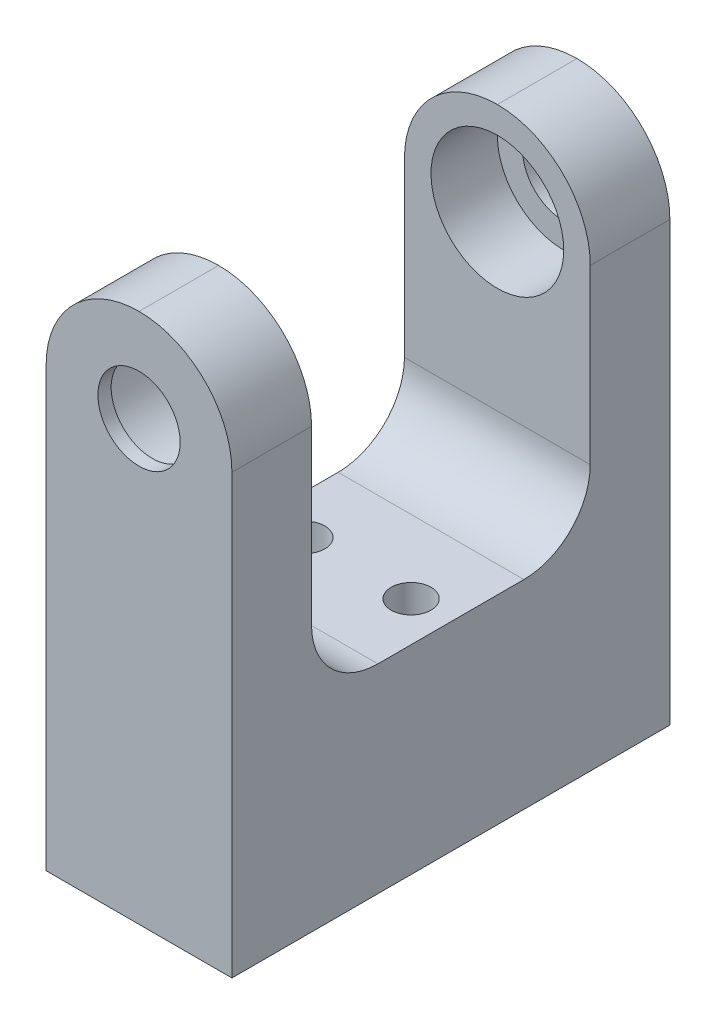
ISO-10303-21;
HEADER;
FILE_DESCRIPTION(('STEP AP214'),'2;1');
FILE_NAME('part.step','',(''),(''),'','','');
FILE_SCHEMA(('AUTOMOTIVE_DESIGN { 1 0 10303 214 1 1 1 1 }'));
ENDSEC;
DATA;
#1=APPLICATION_CONTEXT('core data for automotive mechanical design processes');
#2=APPLICATION_PROTOCOL_DEFINITION('international standard','automotive_design',2000,#1);
#3=PRODUCT_CONTEXT('',#1,'mechanical');
#4=PRODUCT('Part','Part','',(#3));
#5=PRODUCT_RELATED_PRODUCT_CATEGORY('part','',(#4));
#6=PRODUCT_DEFINITION_FORMATION('','',#4);
#7=PRODUCT_DEFINITION_CONTEXT('part definition',#1,'design');
#8=PRODUCT_DEFINITION('design','',#6,#7);
#9=PRODUCT_DEFINITION_SHAPE('','',#8);
#10=(LENGTH_UNIT() NAMED_UNIT(*) SI_UNIT(.MILLI.,.METRE.));
#11=(NAMED_UNIT(*) PLANE_ANGLE_UNIT() SI_UNIT($,.RADIAN.));
#12=(NAMED_UNIT(*) SI_UNIT($,.STERADIAN.) SOLID_ANGLE_UNIT());
#13=UNCERTAINTY_MEASURE_WITH_UNIT(LENGTH_MEASURE(1.E-05),#10,'distance_accuracy_value','');
#14=(GEOMETRIC_REPRESENTATION_CONTEXT(3) GLOBAL_UNCERTAINTY_ASSIGNED_CONTEXT((#13)) GLOBAL_UNIT_ASSIGNED_CONTEXT((#10,
#11,#12)) REPRESENTATION_CONTEXT('',''));
#15=CARTESIAN_POINT('',(0.,0.,0.));
#16=DIRECTION('',(0.,0.,1.));
#17=DIRECTION('',(1.,0.,0.));
#18=AXIS2_PLACEMENT_3D('',#15,#16,#17);
#19=CARTESIAN_POINT('',(14.,0.,0.));
#20=DIRECTION('',(0.,1.,0.));
#21=DIRECTION('',(0.,0.,1.));
#22=AXIS2_PLACEMENT_3D('',#19,#20,#21);
#23=PLANE('',#22);
#24=CARTESIAN_POINT('',(3.,0.,0.));
#25=DIRECTION('',(0.,1.,0.));
#26=DIRECTION('',(0.,0.,1.));
#27=AXIS2_PLACEMENT_3D('',#24,#25,#26);
#28=CIRCLE('',#27,1.5);
#29=CARTESIAN_POINT('',(3.,0.,1.5));
#30=VERTEX_POINT('',#29);
#31=EDGE_CURVE('E233',#30,#30,#28,.T.);
#32=ORIENTED_EDGE('',*,*,#31,.T.);
#33=EDGE_LOOP('',(#32));
#34=FACE_BOUND('',#33,.T.);
#35=CARTESIAN_POINT('',(11.,0.,0.));
#36=DIRECTION('',(0.,1.,0.));
#37=DIRECTION('',(0.,0.,1.));
#38=AXIS2_PLACEMENT_3D('',#35,#36,#37);
#39=CIRCLE('',#38,1.5);
#40=CARTESIAN_POINT('',(11.,0.,1.5));
#41=VERTEX_POINT('',#40);
#42=EDGE_CURVE('E225',#41,#41,#39,.T.);
#43=ORIENTED_EDGE('',*,*,#42,.T.);
#44=EDGE_LOOP('',(#43));
#45=FACE_BOUND('',#44,.T.);
#46=DIRECTION('',(0.,0.,-1.));
#47=VECTOR('',#46,1.);
#48=CARTESIAN_POINT('',(0.,0.,0.));
#49=LINE('',#48,#47);
#50=CARTESIAN_POINT('',(0.,0.,16.5));
#51=VERTEX_POINT('',#50);
#52=CARTESIAN_POINT('',(0.,0.,-16.5));
#53=VERTEX_POINT('',#52);
#54=EDGE_CURVE('E139',#51,#53,#49,.T.);
#55=ORIENTED_EDGE('',*,*,#54,.T.);
#56=DIRECTION('',(-1.,0.,0.));
#57=VECTOR('',#56,1.);
#58=CARTESIAN_POINT('',(14.,0.,-16.5));
#59=LINE('',#58,#57);
#60=CARTESIAN_POINT('',(14.,0.,-16.5));
#61=VERTEX_POINT('',#60);
#62=EDGE_CURVE('E137',#61,#53,#59,.T.);
#63=ORIENTED_EDGE('',*,*,#62,.F.);
#64=DIRECTION('',(0.,0.,-1.));
#65=VECTOR('',#64,1.);
#66=CARTESIAN_POINT('',(14.,0.,16.5));
#67=LINE('',#66,#65);
#68=CARTESIAN_POINT('',(14.,0.,16.5));
#69=VERTEX_POINT('',#68);
#70=EDGE_CURVE('E124',#69,#61,#67,.T.);
#71=ORIENTED_EDGE('',*,*,#70,.F.);
#72=DIRECTION('',(-1.,0.,0.));
#73=VECTOR('',#72,1.);
#74=CARTESIAN_POINT('',(14.,0.,16.5));
#75=LINE('',#74,#73);
#76=EDGE_CURVE('E160',#69,#51,#75,.T.);
#77=ORIENTED_EDGE('',*,*,#76,.T.);
#78=EDGE_LOOP('',(#55,#63,#71,#77));
#79=FACE_BOUND('',#78,.T.);
#80=ADVANCED_FACE('F36',(#34,#45,#79),#23,.F.);
#81=CARTESIAN_POINT('',(14.,0.,-16.5));
#82=DIRECTION('',(0.,0.,1.));
#83=DIRECTION('',(1.,0.,0.));
#84=AXIS2_PLACEMENT_3D('',#81,#82,#83);
#85=PLANE('',#84);
#86=CARTESIAN_POINT('',(7.,33.,-16.5));
#87=DIRECTION('',(0.,0.,1.));
#88=DIRECTION('',(1.,0.,0.));
#89=AXIS2_PLACEMENT_3D('',#86,#87,#88);
#90=CIRCLE('',#89,3.1);
#91=CARTESIAN_POINT('',(10.1,33.,-16.5));
#92=VERTEX_POINT('',#91);
#93=EDGE_CURVE('E241',#92,#92,#90,.T.);
#94=ORIENTED_EDGE('',*,*,#93,.T.);
#95=EDGE_LOOP('',(#94));
#96=FACE_BOUND('',#95,.T.);
#97=DIRECTION('',(0.,1.,0.));
#98=VECTOR('',#97,1.);
#99=CARTESIAN_POINT('',(0.,0.,-16.5));
#100=LINE('',#99,#98);
#101=CARTESIAN_POINT('',(0.,33.,-16.5));
#102=VERTEX_POINT('',#101);
#103=EDGE_CURVE('E162',#53,#102,#100,.T.);
#104=ORIENTED_EDGE('',*,*,#103,.T.);
#105=CARTESIAN_POINT('',(7.,33.,-16.5));
#106=DIRECTION('',(0.,0.,1.));
#107=DIRECTION('',(1.,0.,0.));
#108=AXIS2_PLACEMENT_3D('',#105,#106,#107);
#109=CIRCLE('',#108,7.);
#110=CARTESIAN_POINT('',(7.,40.,-16.5));
#111=VERTEX_POINT('',#110);
#112=EDGE_CURVE('E58',#102,#111,#109,.F.);
#113=ORIENTED_EDGE('',*,*,#112,.T.);
#114=CARTESIAN_POINT('',(7.,33.,-16.5));
#115=DIRECTION('',(0.,0.,1.));
#116=DIRECTION('',(1.,0.,0.));
#117=AXIS2_PLACEMENT_3D('',#114,#115,#116);
#118=CIRCLE('',#117,7.);
#119=CARTESIAN_POINT('',(14.,33.,-16.5));
#120=VERTEX_POINT('',#119);
#121=EDGE_CURVE('E53',#111,#120,#118,.F.);
#122=ORIENTED_EDGE('',*,*,#121,.T.);
#123=DIRECTION('',(0.,1.,0.));
#124=VECTOR('',#123,1.);
#125=CARTESIAN_POINT('',(14.,0.,-16.5));
#126=LINE('',#125,#124);
#127=EDGE_CURVE('E127',#61,#120,#126,.T.);
#128=ORIENTED_EDGE('',*,*,#127,.F.);
#129=ORIENTED_EDGE('',*,*,#62,.T.);
#130=EDGE_LOOP('',(#104,#113,#122,#128,#129));
#131=FACE_BOUND('',#130,.T.);
#132=ADVANCED_FACE('F144',(#96,#131),#85,.F.);
#133=CARTESIAN_POINT('',(14.,40.,-10.5));
#134=DIRECTION('',(0.,0.,-1.));
#135=DIRECTION('',(0.,1.,0.));
#136=AXIS2_PLACEMENT_3D('',#133,#134,#135);
#137=PLANE('',#136);
#138=CARTESIAN_POINT('',(7.,33.,-10.5));
#139=DIRECTION('',(0.,0.,-1.));
#140=DIRECTION('',(0.,1.,0.));
#141=AXIS2_PLACEMENT_3D('',#138,#139,#140);
#142=CIRCLE('',#141,5.);
#143=CARTESIAN_POINT('',(7.,38.,-10.5));
#144=VERTEX_POINT('',#143);
#145=EDGE_CURVE('E214',#144,#144,#142,.T.);
#146=ORIENTED_EDGE('',*,*,#145,.T.);
#147=EDGE_LOOP('',(#146));
#148=FACE_BOUND('',#147,.T.);
#149=CARTESIAN_POINT('',(7.,33.,-10.5));
#150=DIRECTION('',(0.,0.,-1.));
#151=DIRECTION('',(0.,1.,0.));
#152=AXIS2_PLACEMENT_3D('',#149,#150,#151);
#153=CIRCLE('',#152,7.);
#154=CARTESIAN_POINT('',(14.,33.,-10.5));
#155=VERTEX_POINT('',#154);
#156=CARTESIAN_POINT('',(7.,40.,-10.5));
#157=VERTEX_POINT('',#156);
#158=EDGE_CURVE('E202',#155,#157,#153,.F.);
#159=ORIENTED_EDGE('',*,*,#158,.T.);
#160=CARTESIAN_POINT('',(7.,33.,-10.5));
#161=DIRECTION('',(0.,0.,-1.));
#162=DIRECTION('',(0.,1.,0.));
#163=AXIS2_PLACEMENT_3D('',#160,#161,#162);
#164=CIRCLE('',#163,7.);
#165=CARTESIAN_POINT('',(0.,33.,-10.5));
#166=VERTEX_POINT('',#165);
#167=EDGE_CURVE('E204',#157,#166,#164,.F.);
#168=ORIENTED_EDGE('',*,*,#167,.T.);
#169=DIRECTION('',(0.,-1.,0.));
#170=VECTOR('',#169,1.);
#171=CARTESIAN_POINT('',(0.,40.,-10.5));
#172=LINE('',#171,#170);
#173=CARTESIAN_POINT('',(0.,20.,-10.5));
#174=VERTEX_POINT('',#173);
#175=EDGE_CURVE('E165',#166,#174,#172,.T.);
#176=ORIENTED_EDGE('',*,*,#175,.T.);
#177=DIRECTION('',(-1.,0.,0.));
#178=VECTOR('',#177,1.);
#179=CARTESIAN_POINT('',(14.,20.,-10.5));
#180=LINE('',#179,#178);
#181=CARTESIAN_POINT('',(14.,20.,-10.5));
#182=VERTEX_POINT('',#181);
#183=EDGE_CURVE('E142',#182,#174,#180,.T.);
#184=ORIENTED_EDGE('',*,*,#183,.F.);
#185=DIRECTION('',(0.,-1.,0.));
#186=VECTOR('',#185,1.);
#187=CARTESIAN_POINT('',(14.,40.,-10.5));
#188=LINE('',#187,#186);
#189=EDGE_CURVE('E145',#155,#182,#188,.T.);
#190=ORIENTED_EDGE('',*,*,#189,.F.);
#191=EDGE_LOOP('',(#159,#168,#176,#184,#190));
#192=FACE_BOUND('',#191,.T.);
#193=ADVANCED_FACE('F251',(#148,#192),#137,.F.);
#194=CARTESIAN_POINT('',(14.,20.,-5.5));
#195=DIRECTION('',(-1.,0.,0.));
#196=DIRECTION('',(0.,0.,1.));
#197=AXIS2_PLACEMENT_3D('',#194,#195,#196);
#198=CYLINDRICAL_SURFACE('',#197,5.);
#199=CARTESIAN_POINT('',(0.,20.,-5.5));
#200=DIRECTION('',(-1.,0.,0.));
#201=DIRECTION('',(0.,0.,1.));
#202=AXIS2_PLACEMENT_3D('',#199,#200,#201);
#203=CIRCLE('',#202,5.);
#204=CARTESIAN_POINT('',(0.,15.,-5.5));
#205=VERTEX_POINT('',#204);
#206=EDGE_CURVE('E167',#174,#205,#203,.T.);
#207=ORIENTED_EDGE('',*,*,#206,.T.);
#208=DIRECTION('',(-1.,0.,0.));
#209=VECTOR('',#208,1.);
#210=CARTESIAN_POINT('',(14.,15.,-5.5));
#211=LINE('',#210,#209);
#212=CARTESIAN_POINT('',(14.,15.,-5.5));
#213=VERTEX_POINT('',#212);
#214=EDGE_CURVE('E184',#213,#205,#211,.T.);
#215=ORIENTED_EDGE('',*,*,#214,.F.);
#216=CARTESIAN_POINT('',(14.,20.,-5.5));
#217=DIRECTION('',(-1.,0.,0.));
#218=DIRECTION('',(0.,0.,1.));
#219=AXIS2_PLACEMENT_3D('',#216,#217,#218);
#220=CIRCLE('',#219,5.);
#221=EDGE_CURVE('E147',#182,#213,#220,.T.);
#222=ORIENTED_EDGE('',*,*,#221,.F.);
#223=ORIENTED_EDGE('',*,*,#183,.T.);
#224=EDGE_LOOP('',(#207,#215,#222,#223));
#225=FACE_BOUND('',#224,.T.);
#226=ADVANCED_FACE('F311',(#225),#198,.F.);
#227=CARTESIAN_POINT('',(14.,15.,-5.5));
#228=DIRECTION('',(0.,-1.,0.));
#229=DIRECTION('',(0.,0.,-1.));
#230=AXIS2_PLACEMENT_3D('',#227,#228,#229);
#231=PLANE('',#230);
#232=CARTESIAN_POINT('',(3.,15.,0.));
#233=DIRECTION('',(0.,-1.,0.));
#234=DIRECTION('',(0.,0.,-1.));
#235=AXIS2_PLACEMENT_3D('',#232,#233,#234);
#236=CIRCLE('',#235,1.5);
#237=CARTESIAN_POINT('',(3.,15.,-1.49999999999999));
#238=VERTEX_POINT('',#237);
#239=EDGE_CURVE('E40',#238,#238,#236,.T.);
#240=ORIENTED_EDGE('',*,*,#239,.T.);
#241=EDGE_LOOP('',(#240));
#242=FACE_BOUND('',#241,.T.);
#243=CARTESIAN_POINT('',(11.,15.,0.));
#244=DIRECTION('',(0.,-1.,0.));
#245=DIRECTION('',(0.,0.,-1.));
#246=AXIS2_PLACEMENT_3D('',#243,#244,#245);
#247=CIRCLE('',#246,1.5);
#248=CARTESIAN_POINT('',(11.,15.,-1.5));
#249=VERTEX_POINT('',#248);
#250=EDGE_CURVE('E223',#249,#249,#247,.T.);
#251=ORIENTED_EDGE('',*,*,#250,.T.);
#252=EDGE_LOOP('',(#251));
#253=FACE_BOUND('',#252,.T.);
#254=DIRECTION('',(0.,0.,1.));
#255=VECTOR('',#254,1.);
#256=CARTESIAN_POINT('',(0.,15.,-5.5));
#257=LINE('',#256,#255);
#258=CARTESIAN_POINT('',(0.,15.,5.50000000000001));
#259=VERTEX_POINT('',#258);
#260=EDGE_CURVE('E169',#205,#259,#257,.T.);
#261=ORIENTED_EDGE('',*,*,#260,.T.);
#262=DIRECTION('',(-1.,0.,0.));
#263=VECTOR('',#262,1.);
#264=CARTESIAN_POINT('',(14.,15.,5.50000000000001));
#265=LINE('',#264,#263);
#266=CARTESIAN_POINT('',(14.,15.,5.50000000000001));
#267=VERTEX_POINT('',#266);
#268=EDGE_CURVE('E181',#267,#259,#265,.T.);
#269=ORIENTED_EDGE('',*,*,#268,.F.);
#270=DIRECTION('',(0.,0.,1.));
#271=VECTOR('',#270,1.);
#272=CARTESIAN_POINT('',(14.,15.,-5.5));
#273=LINE('',#272,#271);
#274=EDGE_CURVE('E152',#213,#267,#273,.T.);
#275=ORIENTED_EDGE('',*,*,#274,.F.);
#276=ORIENTED_EDGE('',*,*,#214,.T.);
#277=EDGE_LOOP('',(#261,#269,#275,#276));
#278=FACE_BOUND('',#277,.T.);
#279=ADVANCED_FACE('F319',(#242,#253,#278),#231,.F.);
#280=CARTESIAN_POINT('',(14.,20.,5.50000000000001));
#281=DIRECTION('',(-1.,0.,0.));
#282=DIRECTION('',(0.,0.,1.));
#283=AXIS2_PLACEMENT_3D('',#280,#281,#282);
#284=CYLINDRICAL_SURFACE('',#283,5.);
#285=CARTESIAN_POINT('',(0.,20.,5.50000000000001));
#286=DIRECTION('',(-1.,0.,0.));
#287=DIRECTION('',(0.,0.,1.));
#288=AXIS2_PLACEMENT_3D('',#285,#286,#287);
#289=CIRCLE('',#288,5.);
#290=CARTESIAN_POINT('',(0.,20.,10.5));
#291=VERTEX_POINT('',#290);
#292=EDGE_CURVE('E171',#259,#291,#289,.T.);
#293=ORIENTED_EDGE('',*,*,#292,.T.);
#294=DIRECTION('',(-1.,0.,0.));
#295=VECTOR('',#294,1.);
#296=CARTESIAN_POINT('',(14.,20.,10.5));
#297=LINE('',#296,#295);
#298=CARTESIAN_POINT('',(14.,20.,10.5));
#299=VERTEX_POINT('',#298);
#300=EDGE_CURVE('E178',#299,#291,#297,.T.);
#301=ORIENTED_EDGE('',*,*,#300,.F.);
#302=CARTESIAN_POINT('',(14.,20.,5.50000000000001));
#303=DIRECTION('',(-1.,0.,0.));
#304=DIRECTION('',(0.,0.,1.));
#305=AXIS2_PLACEMENT_3D('',#302,#303,#304);
#306=CIRCLE('',#305,5.);
#307=EDGE_CURVE('E154',#267,#299,#306,.T.);
#308=ORIENTED_EDGE('',*,*,#307,.F.);
#309=ORIENTED_EDGE('',*,*,#268,.T.);
#310=EDGE_LOOP('',(#293,#301,#308,#309));
#311=FACE_BOUND('',#310,.T.);
#312=ADVANCED_FACE('F322',(#311),#284,.F.);
#313=CARTESIAN_POINT('',(14.,20.,10.5));
#314=DIRECTION('',(0.,0.,1.));
#315=DIRECTION('',(1.,0.,0.));
#316=AXIS2_PLACEMENT_3D('',#313,#314,#315);
#317=PLANE('',#316);
#318=CARTESIAN_POINT('',(7.,33.,10.5));
#319=DIRECTION('',(0.,0.,1.));
#320=DIRECTION('',(1.,0.,0.));
#321=AXIS2_PLACEMENT_3D('',#318,#319,#320);
#322=CIRCLE('',#321,5.);
#323=CARTESIAN_POINT('',(12.,33.,10.5));
#324=VERTEX_POINT('',#323);
#325=EDGE_CURVE('E215',#324,#324,#322,.T.);
#326=ORIENTED_EDGE('',*,*,#325,.T.);
#327=EDGE_LOOP('',(#326));
#328=FACE_BOUND('',#327,.T.);
#329=DIRECTION('',(0.,1.,0.));
#330=VECTOR('',#329,1.);
#331=CARTESIAN_POINT('',(0.,20.,10.5));
#332=LINE('',#331,#330);
#333=CARTESIAN_POINT('',(0.,33.,10.5));
#334=VERTEX_POINT('',#333);
#335=EDGE_CURVE('E173',#291,#334,#332,.T.);
#336=ORIENTED_EDGE('',*,*,#335,.T.);
#337=CARTESIAN_POINT('',(7.,33.,10.5));
#338=DIRECTION('',(0.,0.,1.));
#339=DIRECTION('',(1.,0.,0.));
#340=AXIS2_PLACEMENT_3D('',#337,#338,#339);
#341=CIRCLE('',#340,7.);
#342=CARTESIAN_POINT('',(7.,40.,10.5));
#343=VERTEX_POINT('',#342);
#344=EDGE_CURVE('E200',#334,#343,#341,.F.);
#345=ORIENTED_EDGE('',*,*,#344,.T.);
#346=CARTESIAN_POINT('',(7.,33.,10.5));
#347=DIRECTION('',(0.,0.,1.));
#348=DIRECTION('',(1.,0.,0.));
#349=AXIS2_PLACEMENT_3D('',#346,#347,#348);
#350=CIRCLE('',#349,7.);
#351=CARTESIAN_POINT('',(14.,33.,10.5));
#352=VERTEX_POINT('',#351);
#353=EDGE_CURVE('E198',#343,#352,#350,.F.);
#354=ORIENTED_EDGE('',*,*,#353,.T.);
#355=DIRECTION('',(0.,1.,0.));
#356=VECTOR('',#355,1.);
#357=CARTESIAN_POINT('',(14.,20.,10.5));
#358=LINE('',#357,#356);
#359=EDGE_CURVE('E156',#299,#352,#358,.T.);
#360=ORIENTED_EDGE('',*,*,#359,.F.);
#361=ORIENTED_EDGE('',*,*,#300,.T.);
#362=EDGE_LOOP('',(#336,#345,#354,#360,#361));
#363=FACE_BOUND('',#362,.T.);
#364=ADVANCED_FACE('F326',(#328,#363),#317,.F.);
#365=CARTESIAN_POINT('',(14.,40.,16.5));
#366=DIRECTION('',(0.,0.,-1.));
#367=DIRECTION('',(0.,1.,0.));
#368=AXIS2_PLACEMENT_3D('',#365,#366,#367);
#369=PLANE('',#368);
#370=CARTESIAN_POINT('',(7.,33.,16.5));
#371=DIRECTION('',(0.,0.,1.));
#372=DIRECTION('',(1.,0.,0.));
#373=AXIS2_PLACEMENT_3D('',#370,#371,#372);
#374=CIRCLE('',#373,3.1);
#375=CARTESIAN_POINT('',(10.1,33.,16.5));
#376=VERTEX_POINT('',#375);
#377=EDGE_CURVE('E222',#376,#376,#374,.T.);
#378=ORIENTED_EDGE('',*,*,#377,.F.);
#379=EDGE_LOOP('',(#378));
#380=FACE_BOUND('',#379,.T.);
#381=CARTESIAN_POINT('',(7.,33.,16.5));
#382=DIRECTION('',(0.,0.,-1.));
#383=DIRECTION('',(0.,1.,0.));
#384=AXIS2_PLACEMENT_3D('',#381,#382,#383);
#385=CIRCLE('',#384,7.);
#386=CARTESIAN_POINT('',(14.,33.,16.5));
#387=VERTEX_POINT('',#386);
#388=CARTESIAN_POINT('',(7.,40.,16.5));
#389=VERTEX_POINT('',#388);
#390=EDGE_CURVE('E141',#387,#389,#385,.F.);
#391=ORIENTED_EDGE('',*,*,#390,.T.);
#392=CARTESIAN_POINT('',(7.,33.,16.5));
#393=DIRECTION('',(0.,0.,-1.));
#394=DIRECTION('',(0.,1.,0.));
#395=AXIS2_PLACEMENT_3D('',#392,#393,#394);
#396=CIRCLE('',#395,7.);
#397=CARTESIAN_POINT('',(0.,33.,16.5));
#398=VERTEX_POINT('',#397);
#399=EDGE_CURVE('E190',#389,#398,#396,.F.);
#400=ORIENTED_EDGE('',*,*,#399,.T.);
#401=DIRECTION('',(0.,-1.,0.));
#402=VECTOR('',#401,1.);
#403=CARTESIAN_POINT('',(0.,40.,16.5));
#404=LINE('',#403,#402);
#405=EDGE_CURVE('E134',#398,#51,#404,.T.);
#406=ORIENTED_EDGE('',*,*,#405,.T.);
#407=ORIENTED_EDGE('',*,*,#76,.F.);
#408=DIRECTION('',(0.,-1.,0.));
#409=VECTOR('',#408,1.);
#410=CARTESIAN_POINT('',(14.,40.,16.5));
#411=LINE('',#410,#409);
#412=EDGE_CURVE('E130',#387,#69,#411,.T.);
#413=ORIENTED_EDGE('',*,*,#412,.F.);
#414=EDGE_LOOP('',(#391,#400,#406,#407,#413));
#415=FACE_BOUND('',#414,.T.);
#416=ADVANCED_FACE('F333',(#380,#415),#369,.F.);
#417=CARTESIAN_POINT('',(14.,20.,-5.5));
#418=DIRECTION('',(-1.,0.,0.));
#419=DIRECTION('',(0.,0.,1.));
#420=AXIS2_PLACEMENT_3D('',#417,#418,#419);
#421=PLANE('',#420);
#422=ORIENTED_EDGE('',*,*,#127,.T.);
#423=DIRECTION('',(0.,0.,1.));
#424=VECTOR('',#423,1.);
#425=CARTESIAN_POINT('',(14.,33.,-5.5));
#426=LINE('',#425,#424);
#427=EDGE_CURVE('E11',#120,#155,#426,.T.);
#428=ORIENTED_EDGE('',*,*,#427,.T.);
#429=ORIENTED_EDGE('',*,*,#189,.T.);
#430=ORIENTED_EDGE('',*,*,#221,.T.);
#431=ORIENTED_EDGE('',*,*,#274,.T.);
#432=ORIENTED_EDGE('',*,*,#307,.T.);
#433=ORIENTED_EDGE('',*,*,#359,.T.);
#434=DIRECTION('',(0.,0.,1.));
#435=VECTOR('',#434,1.);
#436=CARTESIAN_POINT('',(14.,33.,-5.49999999999999));
#437=LINE('',#436,#435);
#438=EDGE_CURVE('E45',#352,#387,#437,.T.);
#439=ORIENTED_EDGE('',*,*,#438,.T.);
#440=ORIENTED_EDGE('',*,*,#412,.T.);
#441=ORIENTED_EDGE('',*,*,#70,.T.);
#442=EDGE_LOOP('',(#422,#428,#429,#430,#431,#432,#433,#439,#440,#441));
#443=FACE_BOUND('',#442,.T.);
#444=ADVANCED_FACE('F126',(#443),#421,.F.);
#445=CARTESIAN_POINT('',(0.,20.,-5.5));
#446=DIRECTION('',(-1.,0.,0.));
#447=DIRECTION('',(0.,0.,1.));
#448=AXIS2_PLACEMENT_3D('',#445,#446,#447);
#449=PLANE('',#448);
#450=ORIENTED_EDGE('',*,*,#405,.F.);
#451=DIRECTION('',(0.,0.,1.));
#452=VECTOR('',#451,1.);
#453=CARTESIAN_POINT('',(0.,33.,10.5));
#454=LINE('',#453,#452);
#455=EDGE_CURVE('E195',#398,#334,#454,.F.);
#456=ORIENTED_EDGE('',*,*,#455,.T.);
#457=ORIENTED_EDGE('',*,*,#335,.F.);
#458=ORIENTED_EDGE('',*,*,#292,.F.);
#459=ORIENTED_EDGE('',*,*,#260,.F.);
#460=ORIENTED_EDGE('',*,*,#206,.F.);
#461=ORIENTED_EDGE('',*,*,#175,.F.);
#462=DIRECTION('',(0.,0.,1.));
#463=VECTOR('',#462,1.);
#464=CARTESIAN_POINT('',(0.,33.,-16.5));
#465=LINE('',#464,#463);
#466=EDGE_CURVE('E192',#166,#102,#465,.F.);
#467=ORIENTED_EDGE('',*,*,#466,.T.);
#468=ORIENTED_EDGE('',*,*,#103,.F.);
#469=ORIENTED_EDGE('',*,*,#54,.F.);
#470=EDGE_LOOP('',(#450,#456,#457,#458,#459,#460,#461,#467,#468,#469));
#471=FACE_BOUND('',#470,.T.);
#472=ADVANCED_FACE('F288',(#471),#449,.T.);
#473=CARTESIAN_POINT('',(7.,33.,-5.49999999999999));
#474=DIRECTION('',(0.,0.,1.));
#475=DIRECTION('',(0.,-1.,0.));
#476=AXIS2_PLACEMENT_3D('',#473,#474,#475);
#477=CYLINDRICAL_SURFACE('',#476,7.);
#478=ORIENTED_EDGE('',*,*,#438,.F.);
#479=ORIENTED_EDGE('',*,*,#353,.F.);
#480=DIRECTION('',(0.,0.,1.));
#481=VECTOR('',#480,1.);
#482=CARTESIAN_POINT('',(7.,40.,10.5));
#483=LINE('',#482,#481);
#484=EDGE_CURVE('E163',#389,#343,#483,.F.);
#485=ORIENTED_EDGE('',*,*,#484,.F.);
#486=ORIENTED_EDGE('',*,*,#390,.F.);
#487=EDGE_LOOP('',(#478,#479,#485,#486));
#488=FACE_BOUND('',#487,.T.);
#489=ADVANCED_FACE('F285',(#488),#477,.T.);
#490=CARTESIAN_POINT('',(7.,33.,10.5));
#491=DIRECTION('',(0.,0.,-1.));
#492=DIRECTION('',(0.,1.,0.));
#493=AXIS2_PLACEMENT_3D('',#490,#491,#492);
#494=CYLINDRICAL_SURFACE('',#493,7.);
#495=ORIENTED_EDGE('',*,*,#344,.F.);
#496=ORIENTED_EDGE('',*,*,#455,.F.);
#497=ORIENTED_EDGE('',*,*,#399,.F.);
#498=ORIENTED_EDGE('',*,*,#484,.T.);
#499=EDGE_LOOP('',(#495,#496,#497,#498));
#500=FACE_BOUND('',#499,.T.);
#501=ADVANCED_FACE('F282',(#500),#494,.T.);
#502=CARTESIAN_POINT('',(7.,33.,-5.5));
#503=DIRECTION('',(0.,0.,1.));
#504=DIRECTION('',(1.,0.,0.));
#505=AXIS2_PLACEMENT_3D('',#502,#503,#504);
#506=CYLINDRICAL_SURFACE('',#505,7.);
#507=ORIENTED_EDGE('',*,*,#427,.F.);
#508=ORIENTED_EDGE('',*,*,#121,.F.);
#509=DIRECTION('',(0.,0.,1.));
#510=VECTOR('',#509,1.);
#511=CARTESIAN_POINT('',(7.,40.,-16.5));
#512=LINE('',#511,#510);
#513=EDGE_CURVE('E211',#157,#111,#512,.F.);
#514=ORIENTED_EDGE('',*,*,#513,.F.);
#515=ORIENTED_EDGE('',*,*,#158,.F.);
#516=EDGE_LOOP('',(#507,#508,#514,#515));
#517=FACE_BOUND('',#516,.T.);
#518=ADVANCED_FACE('F38',(#517),#506,.T.);
#519=CARTESIAN_POINT('',(7.,33.,-16.5));
#520=DIRECTION('',(0.,0.,-1.));
#521=DIRECTION('',(-1.,0.,0.));
#522=AXIS2_PLACEMENT_3D('',#519,#520,#521);
#523=CYLINDRICAL_SURFACE('',#522,7.);
#524=ORIENTED_EDGE('',*,*,#112,.F.);
#525=ORIENTED_EDGE('',*,*,#466,.F.);
#526=ORIENTED_EDGE('',*,*,#167,.F.);
#527=ORIENTED_EDGE('',*,*,#513,.T.);
#528=EDGE_LOOP('',(#524,#525,#526,#527));
#529=FACE_BOUND('',#528,.T.);
#530=ADVANCED_FACE('F290',(#529),#523,.T.);
#531=CARTESIAN_POINT('',(7.,33.,15.5));
#532=DIRECTION('',(0.,0.,1.));
#533=DIRECTION('',(1.,0.,0.));
#534=AXIS2_PLACEMENT_3D('',#531,#532,#533);
#535=PLANE('',#534);
#536=CARTESIAN_POINT('',(7.,33.,15.5));
#537=DIRECTION('',(0.,0.,1.));
#538=DIRECTION('',(1.,0.,0.));
#539=AXIS2_PLACEMENT_3D('',#536,#537,#538);
#540=CIRCLE('',#539,3.1);
#541=CARTESIAN_POINT('',(10.1,33.,15.5));
#542=VERTEX_POINT('',#541);
#543=EDGE_CURVE('E221',#542,#542,#540,.T.);
#544=ORIENTED_EDGE('',*,*,#543,.T.);
#545=EDGE_LOOP('',(#544));
#546=FACE_BOUND('',#545,.T.);
#547=CARTESIAN_POINT('',(7.,33.,15.5));
#548=DIRECTION('',(0.,0.,1.));
#549=DIRECTION('',(1.,0.,0.));
#550=AXIS2_PLACEMENT_3D('',#547,#548,#549);
#551=CIRCLE('',#550,5.);
#552=CARTESIAN_POINT('',(12.,33.,15.5));
#553=VERTEX_POINT('',#552);
#554=EDGE_CURVE('E244',#553,#553,#551,.T.);
#555=ORIENTED_EDGE('',*,*,#554,.F.);
#556=EDGE_LOOP('',(#555));
#557=FACE_BOUND('',#556,.T.);
#558=ADVANCED_FACE('F267',(#546,#557),#535,.F.);
#559=CARTESIAN_POINT('',(7.,33.,-15.5));
#560=DIRECTION('',(0.,0.,1.));
#561=DIRECTION('',(1.,0.,0.));
#562=AXIS2_PLACEMENT_3D('',#559,#560,#561);
#563=CYLINDRICAL_SURFACE('',#562,5.);
#564=ORIENTED_EDGE('',*,*,#554,.T.);
#565=EDGE_LOOP('',(#564));
#566=FACE_BOUND('',#565,.T.);
#567=ORIENTED_EDGE('',*,*,#325,.F.);
#568=EDGE_LOOP('',(#567));
#569=FACE_BOUND('',#568,.T.);
#570=ADVANCED_FACE('F257',(#566,#569),#563,.F.);
#571=CARTESIAN_POINT('',(7.,33.,-15.5));
#572=DIRECTION('',(0.,0.,1.));
#573=DIRECTION('',(1.,0.,0.));
#574=AXIS2_PLACEMENT_3D('',#571,#572,#573);
#575=CIRCLE('',#574,5.);
#576=CARTESIAN_POINT('',(12.,33.,-15.5));
#577=VERTEX_POINT('',#576);
#578=EDGE_CURVE('E218',#577,#577,#575,.T.);
#579=ORIENTED_EDGE('',*,*,#578,.F.);
#580=EDGE_LOOP('',(#579));
#581=FACE_BOUND('',#580,.T.);
#582=ORIENTED_EDGE('',*,*,#145,.F.);
#583=EDGE_LOOP('',(#582));
#584=FACE_BOUND('',#583,.T.);
#585=ADVANCED_FACE('F254',(#581,#584),#563,.F.);
#586=CARTESIAN_POINT('',(7.,33.,-15.5));
#587=DIRECTION('',(0.,0.,1.));
#588=DIRECTION('',(1.,0.,0.));
#589=AXIS2_PLACEMENT_3D('',#586,#587,#588);
#590=PLANE('',#589);
#591=CARTESIAN_POINT('',(7.,33.,-15.5));
#592=DIRECTION('',(0.,0.,1.));
#593=DIRECTION('',(1.,0.,0.));
#594=AXIS2_PLACEMENT_3D('',#591,#592,#593);
#595=CIRCLE('',#594,3.1);
#596=CARTESIAN_POINT('',(10.1,33.,-15.5));
#597=VERTEX_POINT('',#596);
#598=EDGE_CURVE('E219',#597,#597,#595,.T.);
#599=ORIENTED_EDGE('',*,*,#598,.F.);
#600=EDGE_LOOP('',(#599));
#601=FACE_BOUND('',#600,.T.);
#602=ORIENTED_EDGE('',*,*,#578,.T.);
#603=EDGE_LOOP('',(#602));
#604=FACE_BOUND('',#603,.T.);
#605=ADVANCED_FACE('F256',(#601,#604),#590,.T.);
#606=CARTESIAN_POINT('',(7.,33.,-18.5));
#607=DIRECTION('',(0.,0.,1.));
#608=DIRECTION('',(1.,0.,0.));
#609=AXIS2_PLACEMENT_3D('',#606,#607,#608);
#610=CYLINDRICAL_SURFACE('',#609,3.1);
#611=ORIENTED_EDGE('',*,*,#598,.T.);
#612=EDGE_LOOP('',(#611));
#613=FACE_BOUND('',#612,.T.);
#614=ORIENTED_EDGE('',*,*,#93,.F.);
#615=EDGE_LOOP('',(#614));
#616=FACE_BOUND('',#615,.T.);
#617=ADVANCED_FACE('F264',(#613,#616),#610,.F.);
#618=ORIENTED_EDGE('',*,*,#377,.T.);
#619=EDGE_LOOP('',(#618));
#620=FACE_BOUND('',#619,.T.);
#621=ORIENTED_EDGE('',*,*,#543,.F.);
#622=EDGE_LOOP('',(#621));
#623=FACE_BOUND('',#622,.T.);
#624=ADVANCED_FACE('F451',(#620,#623),#610,.F.);
#625=CARTESIAN_POINT('',(11.,-3.,0.));
#626=DIRECTION('',(0.,1.,0.));
#627=DIRECTION('',(0.,0.,1.));
#628=AXIS2_PLACEMENT_3D('',#625,#626,#627);
#629=CYLINDRICAL_SURFACE('',#628,1.5);
#630=ORIENTED_EDGE('',*,*,#250,.F.);
#631=EDGE_LOOP('',(#630));
#632=FACE_BOUND('',#631,.T.);
#633=ORIENTED_EDGE('',*,*,#42,.F.);
#634=EDGE_LOOP('',(#633));
#635=FACE_BOUND('',#634,.T.);
#636=ADVANCED_FACE('F445',(#632,#635),#629,.F.);
#637=CARTESIAN_POINT('',(3.,-3.,0.));
#638=DIRECTION('',(0.,1.,0.));
#639=DIRECTION('',(0.,0.,1.));
#640=AXIS2_PLACEMENT_3D('',#637,#638,#639);
#641=CYLINDRICAL_SURFACE('',#640,1.5);
#642=ORIENTED_EDGE('',*,*,#239,.F.);
#643=EDGE_LOOP('',(#642));
#644=FACE_BOUND('',#643,.T.);
#645=ORIENTED_EDGE('',*,*,#31,.F.);
#646=EDGE_LOOP('',(#645));
#647=FACE_BOUND('',#646,.T.);
#648=ADVANCED_FACE('F450',(#644,#647),#641,.F.);
#649=CLOSED_SHELL('',(#80,#132,#193,#226,#279,#312,#364,#416,#444,#472,#489,#501,#518,#530,#558,
#570,#585,#605,#617,#624,#636,#648));
#650=MANIFOLD_SOLID_BREP('B2',#649);
#651=ADVANCED_BREP_SHAPE_REPRESENTATION('',(#18,#650),#14);
#652=SHAPE_DEFINITION_REPRESENTATION(#9,#651);
ENDSEC;
END-ISO-10303-21;
